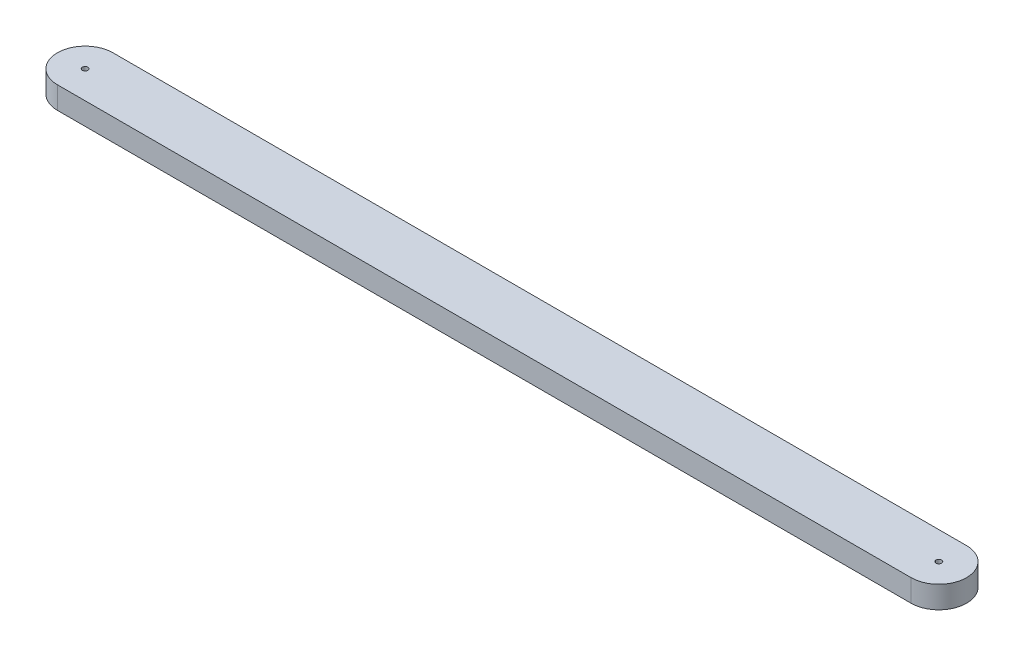
ISO-10303-21;
HEADER;
FILE_DESCRIPTION(('STEP AP214'),'2;1');
FILE_NAME('part.step','',(''),(''),'','','');
FILE_SCHEMA(('AUTOMOTIVE_DESIGN { 1 0 10303 214 1 1 1 1 }'));
ENDSEC;
DATA;
#1=APPLICATION_CONTEXT('core data for automotive mechanical design processes');
#2=APPLICATION_PROTOCOL_DEFINITION('international standard','automotive_design',2000,#1);
#3=PRODUCT_CONTEXT('',#1,'mechanical');
#4=PRODUCT('Part','Part','',(#3));
#5=PRODUCT_RELATED_PRODUCT_CATEGORY('part','',(#4));
#6=PRODUCT_DEFINITION_FORMATION('','',#4);
#7=PRODUCT_DEFINITION_CONTEXT('part definition',#1,'design');
#8=PRODUCT_DEFINITION('design','',#6,#7);
#9=PRODUCT_DEFINITION_SHAPE('','',#8);
#10=(LENGTH_UNIT() NAMED_UNIT(*) SI_UNIT(.MILLI.,.METRE.));
#11=(NAMED_UNIT(*) PLANE_ANGLE_UNIT() SI_UNIT($,.RADIAN.));
#12=(NAMED_UNIT(*) SI_UNIT($,.STERADIAN.) SOLID_ANGLE_UNIT());
#13=UNCERTAINTY_MEASURE_WITH_UNIT(LENGTH_MEASURE(1.E-05),#10,'distance_accuracy_value','');
#14=(GEOMETRIC_REPRESENTATION_CONTEXT(3) GLOBAL_UNCERTAINTY_ASSIGNED_CONTEXT((#13)) GLOBAL_UNIT_ASSIGNED_CONTEXT((#10,
#11,#12)) REPRESENTATION_CONTEXT('',''));
#15=CARTESIAN_POINT('',(0.,0.,0.));
#16=DIRECTION('',(0.,0.,1.));
#17=DIRECTION('',(1.,0.,0.));
#18=AXIS2_PLACEMENT_3D('',#15,#16,#17);
#19=CARTESIAN_POINT('',(76.94,-2.,0.));
#20=DIRECTION('',(0.,1.,0.));
#21=DIRECTION('',(0.,0.,1.));
#22=AXIS2_PLACEMENT_3D('',#19,#20,#21);
#23=CYLINDRICAL_SURFACE('',#22,5.);
#24=DIRECTION('',(0.,1.,0.));
#25=VECTOR('',#24,1.);
#26=CARTESIAN_POINT('',(76.94,-2.,-5.00000000000001));
#27=LINE('',#26,#25);
#28=CARTESIAN_POINT('',(76.94,-2.,-5.00000000000001));
#29=VERTEX_POINT('',#28);
#30=CARTESIAN_POINT('',(76.94,2.,-5.00000000000001));
#31=VERTEX_POINT('',#30);
#32=EDGE_CURVE('E37',#29,#31,#27,.T.);
#33=ORIENTED_EDGE('',*,*,#32,.T.);
#34=CARTESIAN_POINT('',(76.94,2.,0.));
#35=DIRECTION('',(0.,1.,0.));
#36=DIRECTION('',(0.,0.,1.));
#37=AXIS2_PLACEMENT_3D('',#34,#35,#36);
#38=CIRCLE('',#37,5.);
#39=CARTESIAN_POINT('',(76.94,2.,4.99999999999999));
#40=VERTEX_POINT('',#39);
#41=EDGE_CURVE('E77',#31,#40,#38,.F.);
#42=ORIENTED_EDGE('',*,*,#41,.T.);
#43=DIRECTION('',(0.,1.,0.));
#44=VECTOR('',#43,1.);
#45=CARTESIAN_POINT('',(76.94,-2.,4.99999999999999));
#46=LINE('',#45,#44);
#47=CARTESIAN_POINT('',(76.94,-2.,4.99999999999999));
#48=VERTEX_POINT('',#47);
#49=EDGE_CURVE('E11',#48,#40,#46,.T.);
#50=ORIENTED_EDGE('',*,*,#49,.F.);
#51=CARTESIAN_POINT('',(76.94,-2.,0.));
#52=DIRECTION('',(0.,1.,0.));
#53=DIRECTION('',(0.,0.,1.));
#54=AXIS2_PLACEMENT_3D('',#51,#52,#53);
#55=CIRCLE('',#54,5.);
#56=EDGE_CURVE('E50',#29,#48,#55,.F.);
#57=ORIENTED_EDGE('',*,*,#56,.F.);
#58=EDGE_LOOP('',(#33,#42,#50,#57));
#59=FACE_BOUND('',#58,.T.);
#60=ADVANCED_FACE('F34',(#59),#23,.T.);
#61=CARTESIAN_POINT('',(0.,-2.,5.));
#62=DIRECTION('',(0.,0.,1.));
#63=DIRECTION('',(1.,0.,0.));
#64=AXIS2_PLACEMENT_3D('',#61,#62,#63);
#65=PLANE('',#64);
#66=ORIENTED_EDGE('',*,*,#49,.T.);
#67=DIRECTION('',(1.,0.,0.));
#68=VECTOR('',#67,1.);
#69=CARTESIAN_POINT('',(0.,2.,5.));
#70=LINE('',#69,#68);
#71=CARTESIAN_POINT('',(-76.94,2.,5.));
#72=VERTEX_POINT('',#71);
#73=EDGE_CURVE('E90',#72,#40,#70,.T.);
#74=ORIENTED_EDGE('',*,*,#73,.F.);
#75=DIRECTION('',(0.,1.,0.));
#76=VECTOR('',#75,1.);
#77=CARTESIAN_POINT('',(-76.94,-2.,5.));
#78=LINE('',#77,#76);
#79=CARTESIAN_POINT('',(-76.94,-2.,5.));
#80=VERTEX_POINT('',#79);
#81=EDGE_CURVE('E42',#80,#72,#78,.T.);
#82=ORIENTED_EDGE('',*,*,#81,.F.);
#83=DIRECTION('',(1.,0.,0.));
#84=VECTOR('',#83,1.);
#85=CARTESIAN_POINT('',(0.,-2.,5.));
#86=LINE('',#85,#84);
#87=EDGE_CURVE('E110',#80,#48,#86,.T.);
#88=ORIENTED_EDGE('',*,*,#87,.T.);
#89=EDGE_LOOP('',(#66,#74,#82,#88));
#90=FACE_BOUND('',#89,.T.);
#91=ADVANCED_FACE('F120',(#90),#65,.T.);
#92=CARTESIAN_POINT('',(-76.94,-2.,0.));
#93=DIRECTION('',(0.,1.,0.));
#94=DIRECTION('',(0.,0.,1.));
#95=AXIS2_PLACEMENT_3D('',#92,#93,#94);
#96=CYLINDRICAL_SURFACE('',#95,5.);
#97=ORIENTED_EDGE('',*,*,#81,.T.);
#98=CARTESIAN_POINT('',(-76.94,2.,0.));
#99=DIRECTION('',(0.,1.,0.));
#100=DIRECTION('',(0.,0.,1.));
#101=AXIS2_PLACEMENT_3D('',#98,#99,#100);
#102=CIRCLE('',#101,5.);
#103=CARTESIAN_POINT('',(-76.94,2.,-5.));
#104=VERTEX_POINT('',#103);
#105=EDGE_CURVE('E94',#104,#72,#102,.T.);
#106=ORIENTED_EDGE('',*,*,#105,.F.);
#107=DIRECTION('',(0.,1.,0.));
#108=VECTOR('',#107,1.);
#109=CARTESIAN_POINT('',(-76.94,-2.,-5.));
#110=LINE('',#109,#108);
#111=CARTESIAN_POINT('',(-76.94,-2.,-5.));
#112=VERTEX_POINT('',#111);
#113=EDGE_CURVE('E81',#112,#104,#110,.T.);
#114=ORIENTED_EDGE('',*,*,#113,.F.);
#115=CARTESIAN_POINT('',(-76.94,-2.,0.));
#116=DIRECTION('',(0.,1.,0.));
#117=DIRECTION('',(0.,0.,1.));
#118=AXIS2_PLACEMENT_3D('',#115,#116,#117);
#119=CIRCLE('',#118,5.);
#120=EDGE_CURVE('E108',#112,#80,#119,.T.);
#121=ORIENTED_EDGE('',*,*,#120,.T.);
#122=EDGE_LOOP('',(#97,#106,#114,#121));
#123=FACE_BOUND('',#122,.T.);
#124=ADVANCED_FACE('F118',(#123),#96,.T.);
#125=CARTESIAN_POINT('',(76.94,-2.,0.));
#126=DIRECTION('',(0.,1.,0.));
#127=DIRECTION('',(0.,0.,1.));
#128=AXIS2_PLACEMENT_3D('',#125,#126,#127);
#129=CYLINDRICAL_SURFACE('',#128,0.499999999999999);
#130=CARTESIAN_POINT('',(76.94,-2.,0.));
#131=DIRECTION('',(0.,1.,0.));
#132=DIRECTION('',(0.,0.,1.));
#133=AXIS2_PLACEMENT_3D('',#130,#131,#132);
#134=CIRCLE('',#133,0.499999999999999);
#135=CARTESIAN_POINT('',(76.94,-2.,0.499999999999994));
#136=VERTEX_POINT('',#135);
#137=EDGE_CURVE('E112',#136,#136,#134,.T.);
#138=ORIENTED_EDGE('',*,*,#137,.F.);
#139=EDGE_LOOP('',(#138));
#140=FACE_BOUND('',#139,.T.);
#141=CARTESIAN_POINT('',(76.94,2.,0.));
#142=DIRECTION('',(0.,1.,0.));
#143=DIRECTION('',(0.,0.,1.));
#144=AXIS2_PLACEMENT_3D('',#141,#142,#143);
#145=CIRCLE('',#144,0.499999999999999);
#146=CARTESIAN_POINT('',(76.94,2.,0.499999999999994));
#147=VERTEX_POINT('',#146);
#148=EDGE_CURVE('E99',#147,#147,#145,.T.);
#149=ORIENTED_EDGE('',*,*,#148,.T.);
#150=EDGE_LOOP('',(#149));
#151=FACE_BOUND('',#150,.T.);
#152=ADVANCED_FACE('F147',(#140,#151),#129,.F.);
#153=CARTESIAN_POINT('',(0.,-2.,-5.));
#154=DIRECTION('',(0.,0.,1.));
#155=DIRECTION('',(1.,0.,0.));
#156=AXIS2_PLACEMENT_3D('',#153,#154,#155);
#157=PLANE('',#156);
#158=ORIENTED_EDGE('',*,*,#113,.T.);
#159=DIRECTION('',(1.,0.,0.));
#160=VECTOR('',#159,1.);
#161=CARTESIAN_POINT('',(0.,2.,-5.));
#162=LINE('',#161,#160);
#163=EDGE_CURVE('E89',#104,#31,#162,.T.);
#164=ORIENTED_EDGE('',*,*,#163,.T.);
#165=ORIENTED_EDGE('',*,*,#32,.F.);
#166=DIRECTION('',(1.,0.,0.));
#167=VECTOR('',#166,1.);
#168=CARTESIAN_POINT('',(0.,-2.,-5.));
#169=LINE('',#168,#167);
#170=EDGE_CURVE('E106',#112,#29,#169,.T.);
#171=ORIENTED_EDGE('',*,*,#170,.F.);
#172=EDGE_LOOP('',(#158,#164,#165,#171));
#173=FACE_BOUND('',#172,.T.);
#174=ADVANCED_FACE('F92',(#173),#157,.F.);
#175=CARTESIAN_POINT('',(-76.94,-2.,0.));
#176=DIRECTION('',(0.,1.,0.));
#177=DIRECTION('',(0.,0.,1.));
#178=AXIS2_PLACEMENT_3D('',#175,#176,#177);
#179=CYLINDRICAL_SURFACE('',#178,0.499999999999999);
#180=CARTESIAN_POINT('',(-76.94,-2.,0.));
#181=DIRECTION('',(0.,1.,0.));
#182=DIRECTION('',(0.,0.,1.));
#183=AXIS2_PLACEMENT_3D('',#180,#181,#182);
#184=CIRCLE('',#183,0.499999999999999);
#185=CARTESIAN_POINT('',(-76.94,-2.,0.500000000000003));
#186=VERTEX_POINT('',#185);
#187=EDGE_CURVE('E82',#186,#186,#184,.T.);
#188=ORIENTED_EDGE('',*,*,#187,.F.);
#189=EDGE_LOOP('',(#188));
#190=FACE_BOUND('',#189,.T.);
#191=CARTESIAN_POINT('',(-76.94,2.,0.));
#192=DIRECTION('',(0.,1.,0.));
#193=DIRECTION('',(0.,0.,1.));
#194=AXIS2_PLACEMENT_3D('',#191,#192,#193);
#195=CIRCLE('',#194,0.499999999999999);
#196=CARTESIAN_POINT('',(-76.94,2.,0.500000000000003));
#197=VERTEX_POINT('',#196);
#198=EDGE_CURVE('E102',#197,#197,#195,.T.);
#199=ORIENTED_EDGE('',*,*,#198,.T.);
#200=EDGE_LOOP('',(#199));
#201=FACE_BOUND('',#200,.T.);
#202=ADVANCED_FACE('F124',(#190,#201),#179,.F.);
#203=CARTESIAN_POINT('',(0.,-2.,0.));
#204=DIRECTION('',(0.,1.,0.));
#205=DIRECTION('',(0.,0.,1.));
#206=AXIS2_PLACEMENT_3D('',#203,#204,#205);
#207=PLANE('',#206);
#208=ORIENTED_EDGE('',*,*,#56,.T.);
#209=ORIENTED_EDGE('',*,*,#87,.F.);
#210=ORIENTED_EDGE('',*,*,#120,.F.);
#211=ORIENTED_EDGE('',*,*,#170,.T.);
#212=EDGE_LOOP('',(#208,#209,#210,#211));
#213=FACE_BOUND('',#212,.T.);
#214=ORIENTED_EDGE('',*,*,#137,.T.);
#215=EDGE_LOOP('',(#214));
#216=FACE_BOUND('',#215,.T.);
#217=ORIENTED_EDGE('',*,*,#187,.T.);
#218=EDGE_LOOP('',(#217));
#219=FACE_BOUND('',#218,.T.);
#220=ADVANCED_FACE('F121',(#213,#216,#219),#207,.F.);
#221=CARTESIAN_POINT('',(0.,2.,0.));
#222=DIRECTION('',(0.,1.,0.));
#223=DIRECTION('',(0.,0.,1.));
#224=AXIS2_PLACEMENT_3D('',#221,#222,#223);
#225=PLANE('',#224);
#226=ORIENTED_EDGE('',*,*,#41,.F.);
#227=ORIENTED_EDGE('',*,*,#163,.F.);
#228=ORIENTED_EDGE('',*,*,#105,.T.);
#229=ORIENTED_EDGE('',*,*,#73,.T.);
#230=EDGE_LOOP('',(#226,#227,#228,#229));
#231=FACE_BOUND('',#230,.T.);
#232=ORIENTED_EDGE('',*,*,#148,.F.);
#233=EDGE_LOOP('',(#232));
#234=FACE_BOUND('',#233,.T.);
#235=ORIENTED_EDGE('',*,*,#198,.F.);
#236=EDGE_LOOP('',(#235));
#237=FACE_BOUND('',#236,.T.);
#238=ADVANCED_FACE('F86',(#231,#234,#237),#225,.T.);
#239=CLOSED_SHELL('',(#60,#91,#124,#152,#174,#202,#220,#238));
#240=MANIFOLD_SOLID_BREP('B2',#239);
#241=ADVANCED_BREP_SHAPE_REPRESENTATION('',(#18,#240),#14);
#242=SHAPE_DEFINITION_REPRESENTATION(#9,#241);
ENDSEC;
END-ISO-10303-21;
